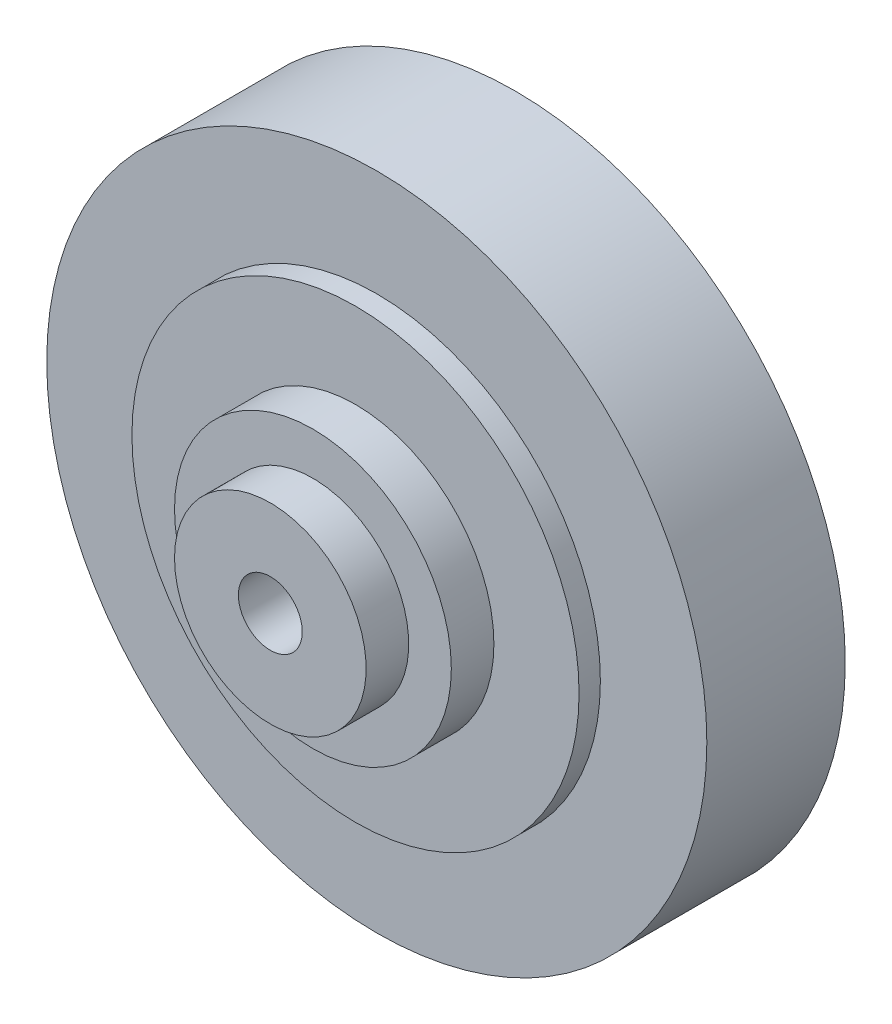
ISO-10303-21;
HEADER;
FILE_DESCRIPTION(('STEP AP214'),'2;1');
FILE_NAME('part.step','',(''),(''),'','','');
FILE_SCHEMA(('AUTOMOTIVE_DESIGN { 1 0 10303 214 1 1 1 1 }'));
ENDSEC;
DATA;
#1=APPLICATION_CONTEXT('core data for automotive mechanical design processes');
#2=APPLICATION_PROTOCOL_DEFINITION('international standard','automotive_design',2000,#1);
#3=PRODUCT_CONTEXT('',#1,'mechanical');
#4=PRODUCT('Part','Part','',(#3));
#5=PRODUCT_RELATED_PRODUCT_CATEGORY('part','',(#4));
#6=PRODUCT_DEFINITION_FORMATION('','',#4);
#7=PRODUCT_DEFINITION_CONTEXT('part definition',#1,'design');
#8=PRODUCT_DEFINITION('design','',#6,#7);
#9=PRODUCT_DEFINITION_SHAPE('','',#8);
#10=(LENGTH_UNIT() NAMED_UNIT(*) SI_UNIT(.MILLI.,.METRE.));
#11=(NAMED_UNIT(*) PLANE_ANGLE_UNIT() SI_UNIT($,.RADIAN.));
#12=(NAMED_UNIT(*) SI_UNIT($,.STERADIAN.) SOLID_ANGLE_UNIT());
#13=UNCERTAINTY_MEASURE_WITH_UNIT(LENGTH_MEASURE(1.E-05),#10,'distance_accuracy_value','');
#14=(GEOMETRIC_REPRESENTATION_CONTEXT(3) GLOBAL_UNCERTAINTY_ASSIGNED_CONTEXT((#13)) GLOBAL_UNIT_ASSIGNED_CONTEXT((#10,
#11,#12)) REPRESENTATION_CONTEXT('',''));
#15=CARTESIAN_POINT('',(0.,0.,0.));
#16=DIRECTION('',(0.,0.,1.));
#17=DIRECTION('',(1.,0.,0.));
#18=AXIS2_PLACEMENT_3D('',#15,#16,#17);
#19=CARTESIAN_POINT('',(0.,9.99999999999999,-2.));
#20=DIRECTION('',(0.,0.,-1.));
#21=DIRECTION('',(-1.,0.,0.));
#22=AXIS2_PLACEMENT_3D('',#19,#20,#21);
#23=PLANE('',#22);
#24=CARTESIAN_POINT('',(0.,0.,-2.));
#25=DIRECTION('',(0.,0.,-1.));
#26=DIRECTION('',(-1.,0.,0.));
#27=AXIS2_PLACEMENT_3D('',#24,#25,#26);
#28=CIRCLE('',#27,9.99999999999999);
#29=CARTESIAN_POINT('',(-9.99999999999999,0.,-2.));
#30=VERTEX_POINT('',#29);
#31=EDGE_CURVE('E76',#30,#30,#28,.T.);
#32=ORIENTED_EDGE('',*,*,#31,.T.);
#33=EDGE_LOOP('',(#32));
#34=FACE_BOUND('',#33,.T.);
#35=CARTESIAN_POINT('',(0.,0.,-2.));
#36=DIRECTION('',(0.,0.,-1.));
#37=DIRECTION('',(-1.,0.,0.));
#38=AXIS2_PLACEMENT_3D('',#35,#36,#37);
#39=CIRCLE('',#38,2.99999999999999);
#40=CARTESIAN_POINT('',(-2.99999999999999,0.,-2.));
#41=VERTEX_POINT('',#40);
#42=EDGE_CURVE('E10',#41,#41,#39,.T.);
#43=ORIENTED_EDGE('',*,*,#42,.F.);
#44=EDGE_LOOP('',(#43));
#45=FACE_BOUND('',#44,.T.);
#46=ADVANCED_FACE('F30',(#34,#45),#23,.T.);
#47=CARTESIAN_POINT('',(0.,0.,0.));
#48=DIRECTION('',(0.,0.,-1.));
#49=DIRECTION('',(-1.,0.,0.));
#50=AXIS2_PLACEMENT_3D('',#47,#48,#49);
#51=CYLINDRICAL_SURFACE('',#50,2.99999999999999);
#52=ORIENTED_EDGE('',*,*,#42,.T.);
#53=EDGE_LOOP('',(#52));
#54=FACE_BOUND('',#53,.T.);
#55=CARTESIAN_POINT('',(0.,0.,23.));
#56=DIRECTION('',(0.,0.,-1.));
#57=DIRECTION('',(-1.,0.,0.));
#58=AXIS2_PLACEMENT_3D('',#55,#56,#57);
#59=CIRCLE('',#58,2.99999999999999);
#60=CARTESIAN_POINT('',(-2.99999999999999,0.,23.));
#61=VERTEX_POINT('',#60);
#62=EDGE_CURVE('E36',#61,#61,#59,.T.);
#63=ORIENTED_EDGE('',*,*,#62,.F.);
#64=EDGE_LOOP('',(#63));
#65=FACE_BOUND('',#64,.T.);
#66=ADVANCED_FACE('F94',(#54,#65),#51,.F.);
#67=CARTESIAN_POINT('',(0.,2.99999999999999,23.));
#68=DIRECTION('',(0.,0.,1.));
#69=DIRECTION('',(1.,0.,0.));
#70=AXIS2_PLACEMENT_3D('',#67,#68,#69);
#71=PLANE('',#70);
#72=ORIENTED_EDGE('',*,*,#62,.T.);
#73=EDGE_LOOP('',(#72));
#74=FACE_BOUND('',#73,.T.);
#75=CARTESIAN_POINT('',(0.,0.,23.));
#76=DIRECTION('',(0.,0.,-1.));
#77=DIRECTION('',(-1.,0.,0.));
#78=AXIS2_PLACEMENT_3D('',#75,#76,#77);
#79=CIRCLE('',#78,9.);
#80=CARTESIAN_POINT('',(-9.,0.,23.));
#81=VERTEX_POINT('',#80);
#82=EDGE_CURVE('E40',#81,#81,#79,.T.);
#83=ORIENTED_EDGE('',*,*,#82,.F.);
#84=EDGE_LOOP('',(#83));
#85=FACE_BOUND('',#84,.T.);
#86=ADVANCED_FACE('F98',(#74,#85),#71,.T.);
#87=CARTESIAN_POINT('',(0.,0.,0.));
#88=DIRECTION('',(0.,0.,-1.));
#89=DIRECTION('',(-1.,0.,0.));
#90=AXIS2_PLACEMENT_3D('',#87,#88,#89);
#91=CYLINDRICAL_SURFACE('',#90,9.);
#92=ORIENTED_EDGE('',*,*,#82,.T.);
#93=EDGE_LOOP('',(#92));
#94=FACE_BOUND('',#93,.T.);
#95=CARTESIAN_POINT('',(0.,0.,19.));
#96=DIRECTION('',(0.,0.,-1.));
#97=DIRECTION('',(-1.,0.,0.));
#98=AXIS2_PLACEMENT_3D('',#95,#96,#97);
#99=CIRCLE('',#98,9.);
#100=CARTESIAN_POINT('',(-9.,0.,19.));
#101=VERTEX_POINT('',#100);
#102=EDGE_CURVE('E44',#101,#101,#99,.T.);
#103=ORIENTED_EDGE('',*,*,#102,.F.);
#104=EDGE_LOOP('',(#103));
#105=FACE_BOUND('',#104,.T.);
#106=ADVANCED_FACE('F102',(#94,#105),#91,.T.);
#107=CARTESIAN_POINT('',(0.,9.,19.));
#108=DIRECTION('',(0.,0.,1.));
#109=DIRECTION('',(1.,0.,0.));
#110=AXIS2_PLACEMENT_3D('',#107,#108,#109);
#111=PLANE('',#110);
#112=ORIENTED_EDGE('',*,*,#102,.T.);
#113=EDGE_LOOP('',(#112));
#114=FACE_BOUND('',#113,.T.);
#115=CARTESIAN_POINT('',(0.,0.,19.));
#116=DIRECTION('',(0.,0.,-1.));
#117=DIRECTION('',(-1.,0.,0.));
#118=AXIS2_PLACEMENT_3D('',#115,#116,#117);
#119=CIRCLE('',#118,13.);
#120=CARTESIAN_POINT('',(-13.,0.,19.));
#121=VERTEX_POINT('',#120);
#122=EDGE_CURVE('E49',#121,#121,#119,.T.);
#123=ORIENTED_EDGE('',*,*,#122,.F.);
#124=EDGE_LOOP('',(#123));
#125=FACE_BOUND('',#124,.T.);
#126=ADVANCED_FACE('F108',(#114,#125),#111,.T.);
#127=CARTESIAN_POINT('',(0.,0.,0.));
#128=DIRECTION('',(0.,0.,-1.));
#129=DIRECTION('',(-1.,0.,0.));
#130=AXIS2_PLACEMENT_3D('',#127,#128,#129);
#131=CYLINDRICAL_SURFACE('',#130,13.);
#132=ORIENTED_EDGE('',*,*,#122,.T.);
#133=EDGE_LOOP('',(#132));
#134=FACE_BOUND('',#133,.T.);
#135=CARTESIAN_POINT('',(0.,0.,15.));
#136=DIRECTION('',(0.,0.,-1.));
#137=DIRECTION('',(-1.,0.,0.));
#138=AXIS2_PLACEMENT_3D('',#135,#136,#137);
#139=CIRCLE('',#138,13.);
#140=CARTESIAN_POINT('',(-13.,0.,15.));
#141=VERTEX_POINT('',#140);
#142=EDGE_CURVE('E52',#141,#141,#139,.T.);
#143=ORIENTED_EDGE('',*,*,#142,.F.);
#144=EDGE_LOOP('',(#143));
#145=FACE_BOUND('',#144,.T.);
#146=ADVANCED_FACE('F112',(#134,#145),#131,.T.);
#147=CARTESIAN_POINT('',(0.,13.,15.));
#148=DIRECTION('',(0.,0.,1.));
#149=DIRECTION('',(1.,0.,0.));
#150=AXIS2_PLACEMENT_3D('',#147,#148,#149);
#151=PLANE('',#150);
#152=ORIENTED_EDGE('',*,*,#142,.T.);
#153=EDGE_LOOP('',(#152));
#154=FACE_BOUND('',#153,.T.);
#155=CARTESIAN_POINT('',(0.,0.,15.));
#156=DIRECTION('',(0.,0.,-1.));
#157=DIRECTION('',(-1.,0.,0.));
#158=AXIS2_PLACEMENT_3D('',#155,#156,#157);
#159=CIRCLE('',#158,21.);
#160=CARTESIAN_POINT('',(-21.,0.,15.));
#161=VERTEX_POINT('',#160);
#162=EDGE_CURVE('E55',#161,#161,#159,.T.);
#163=ORIENTED_EDGE('',*,*,#162,.F.);
#164=EDGE_LOOP('',(#163));
#165=FACE_BOUND('',#164,.T.);
#166=ADVANCED_FACE('F116',(#154,#165),#151,.T.);
#167=CARTESIAN_POINT('',(0.,0.,0.));
#168=DIRECTION('',(0.,0.,-1.));
#169=DIRECTION('',(-1.,0.,0.));
#170=AXIS2_PLACEMENT_3D('',#167,#168,#169);
#171=CYLINDRICAL_SURFACE('',#170,21.);
#172=ORIENTED_EDGE('',*,*,#162,.T.);
#173=EDGE_LOOP('',(#172));
#174=FACE_BOUND('',#173,.T.);
#175=CARTESIAN_POINT('',(0.,0.,13.));
#176=DIRECTION('',(0.,0.,-1.));
#177=DIRECTION('',(-1.,0.,0.));
#178=AXIS2_PLACEMENT_3D('',#175,#176,#177);
#179=CIRCLE('',#178,21.);
#180=CARTESIAN_POINT('',(-21.,0.,13.));
#181=VERTEX_POINT('',#180);
#182=EDGE_CURVE('E58',#181,#181,#179,.T.);
#183=ORIENTED_EDGE('',*,*,#182,.F.);
#184=EDGE_LOOP('',(#183));
#185=FACE_BOUND('',#184,.T.);
#186=ADVANCED_FACE('F120',(#174,#185),#171,.T.);
#187=CARTESIAN_POINT('',(0.,21.,13.));
#188=DIRECTION('',(0.,0.,1.));
#189=DIRECTION('',(1.,0.,0.));
#190=AXIS2_PLACEMENT_3D('',#187,#188,#189);
#191=PLANE('',#190);
#192=ORIENTED_EDGE('',*,*,#182,.T.);
#193=EDGE_LOOP('',(#192));
#194=FACE_BOUND('',#193,.T.);
#195=CARTESIAN_POINT('',(0.,0.,13.));
#196=DIRECTION('',(0.,0.,-1.));
#197=DIRECTION('',(-1.,0.,0.));
#198=AXIS2_PLACEMENT_3D('',#195,#196,#197);
#199=CIRCLE('',#198,31.);
#200=CARTESIAN_POINT('',(-31.,0.,13.));
#201=VERTEX_POINT('',#200);
#202=EDGE_CURVE('E61',#201,#201,#199,.T.);
#203=ORIENTED_EDGE('',*,*,#202,.F.);
#204=EDGE_LOOP('',(#203));
#205=FACE_BOUND('',#204,.T.);
#206=ADVANCED_FACE('F124',(#194,#205),#191,.T.);
#207=CARTESIAN_POINT('',(0.,0.,0.));
#208=DIRECTION('',(0.,0.,-1.));
#209=DIRECTION('',(-1.,0.,0.));
#210=AXIS2_PLACEMENT_3D('',#207,#208,#209);
#211=CYLINDRICAL_SURFACE('',#210,31.);
#212=ORIENTED_EDGE('',*,*,#202,.T.);
#213=EDGE_LOOP('',(#212));
#214=FACE_BOUND('',#213,.T.);
#215=CARTESIAN_POINT('',(0.,0.,0.));
#216=DIRECTION('',(0.,0.,-1.));
#217=DIRECTION('',(-1.,0.,0.));
#218=AXIS2_PLACEMENT_3D('',#215,#216,#217);
#219=CIRCLE('',#218,31.);
#220=CARTESIAN_POINT('',(-31.,0.,0.));
#221=VERTEX_POINT('',#220);
#222=EDGE_CURVE('E64',#221,#221,#219,.T.);
#223=ORIENTED_EDGE('',*,*,#222,.F.);
#224=EDGE_LOOP('',(#223));
#225=FACE_BOUND('',#224,.T.);
#226=ADVANCED_FACE('F128',(#214,#225),#211,.T.);
#227=CARTESIAN_POINT('',(0.,31.,0.));
#228=DIRECTION('',(0.,0.,-1.));
#229=DIRECTION('',(-1.,0.,0.));
#230=AXIS2_PLACEMENT_3D('',#227,#228,#229);
#231=PLANE('',#230);
#232=ORIENTED_EDGE('',*,*,#222,.T.);
#233=EDGE_LOOP('',(#232));
#234=FACE_BOUND('',#233,.T.);
#235=CARTESIAN_POINT('',(0.,0.,0.));
#236=DIRECTION('',(0.,0.,-1.));
#237=DIRECTION('',(-1.,0.,0.));
#238=AXIS2_PLACEMENT_3D('',#235,#236,#237);
#239=CIRCLE('',#238,30.);
#240=CARTESIAN_POINT('',(-30.,0.,0.));
#241=VERTEX_POINT('',#240);
#242=EDGE_CURVE('E67',#241,#241,#239,.T.);
#243=ORIENTED_EDGE('',*,*,#242,.F.);
#244=EDGE_LOOP('',(#243));
#245=FACE_BOUND('',#244,.T.);
#246=ADVANCED_FACE('F132',(#234,#245),#231,.T.);
#247=CARTESIAN_POINT('',(0.,0.,11.));
#248=DIRECTION('',(0.,0.,-1.));
#249=DIRECTION('',(-1.,0.,0.));
#250=AXIS2_PLACEMENT_3D('',#247,#248,#249);
#251=CONICAL_SURFACE('',#250,27.,0.266252049150926);
#252=ORIENTED_EDGE('',*,*,#242,.T.);
#253=EDGE_LOOP('',(#252));
#254=FACE_BOUND('',#253,.T.);
#255=CARTESIAN_POINT('',(0.,0.,11.));
#256=DIRECTION('',(0.,0.,-1.));
#257=DIRECTION('',(-1.,0.,0.));
#258=AXIS2_PLACEMENT_3D('',#255,#256,#257);
#259=CIRCLE('',#258,27.);
#260=CARTESIAN_POINT('',(-27.,0.,11.));
#261=VERTEX_POINT('',#260);
#262=EDGE_CURVE('E70',#261,#261,#259,.T.);
#263=ORIENTED_EDGE('',*,*,#262,.F.);
#264=EDGE_LOOP('',(#263));
#265=FACE_BOUND('',#264,.T.);
#266=ADVANCED_FACE('F90',(#254,#265),#251,.F.);
#267=CARTESIAN_POINT('',(0.,27.,11.));
#268=DIRECTION('',(0.,0.,-1.));
#269=DIRECTION('',(-1.,0.,0.));
#270=AXIS2_PLACEMENT_3D('',#267,#268,#269);
#271=PLANE('',#270);
#272=ORIENTED_EDGE('',*,*,#262,.T.);
#273=EDGE_LOOP('',(#272));
#274=FACE_BOUND('',#273,.T.);
#275=CARTESIAN_POINT('',(0.,0.,11.));
#276=DIRECTION('',(0.,0.,-1.));
#277=DIRECTION('',(-1.,0.,0.));
#278=AXIS2_PLACEMENT_3D('',#275,#276,#277);
#279=CIRCLE('',#278,9.99999999999999);
#280=CARTESIAN_POINT('',(-9.99999999999999,0.,11.));
#281=VERTEX_POINT('',#280);
#282=EDGE_CURVE('E73',#281,#281,#279,.T.);
#283=ORIENTED_EDGE('',*,*,#282,.F.);
#284=EDGE_LOOP('',(#283));
#285=FACE_BOUND('',#284,.T.);
#286=ADVANCED_FACE('F84',(#274,#285),#271,.T.);
#287=CARTESIAN_POINT('',(0.,0.,0.));
#288=DIRECTION('',(0.,0.,-1.));
#289=DIRECTION('',(-1.,0.,0.));
#290=AXIS2_PLACEMENT_3D('',#287,#288,#289);
#291=CYLINDRICAL_SURFACE('',#290,9.99999999999999);
#292=ORIENTED_EDGE('',*,*,#282,.T.);
#293=EDGE_LOOP('',(#292));
#294=FACE_BOUND('',#293,.T.);
#295=ORIENTED_EDGE('',*,*,#31,.F.);
#296=EDGE_LOOP('',(#295));
#297=FACE_BOUND('',#296,.T.);
#298=ADVANCED_FACE('F82',(#294,#297),#291,.T.);
#299=CLOSED_SHELL('',(#46,#66,#86,#106,#126,#146,#166,#186,#206,#226,#246,#266,#286,#298));
#300=MANIFOLD_SOLID_BREP('B2',#299);
#301=ADVANCED_BREP_SHAPE_REPRESENTATION('',(#18,#300),#14);
#302=SHAPE_DEFINITION_REPRESENTATION(#9,#301);
ENDSEC;
END-ISO-10303-21;
